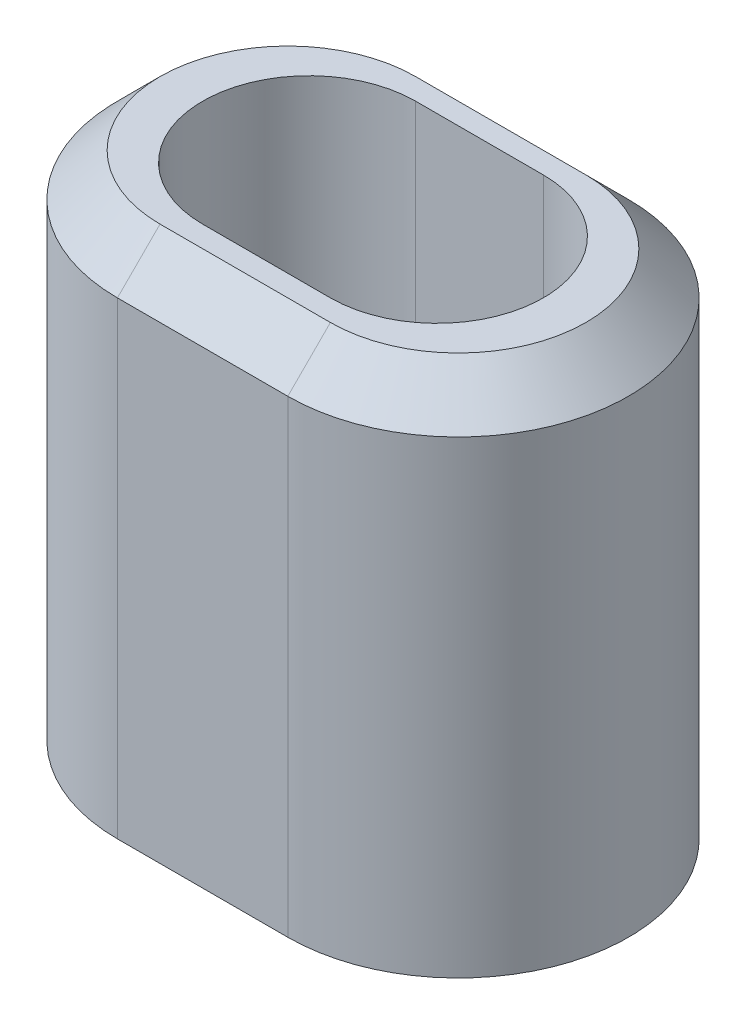
ISO-10303-21;
HEADER;
FILE_DESCRIPTION(('STEP AP214'),'2;1');
FILE_NAME('part.step','',(''),(''),'','','');
FILE_SCHEMA(('AUTOMOTIVE_DESIGN { 1 0 10303 214 1 1 1 1 }'));
ENDSEC;
DATA;
#1=APPLICATION_CONTEXT('core data for automotive mechanical design processes');
#2=APPLICATION_PROTOCOL_DEFINITION('international standard','automotive_design',2000,#1);
#3=PRODUCT_CONTEXT('',#1,'mechanical');
#4=PRODUCT('Part','Part','',(#3));
#5=PRODUCT_RELATED_PRODUCT_CATEGORY('part','',(#4));
#6=PRODUCT_DEFINITION_FORMATION('','',#4);
#7=PRODUCT_DEFINITION_CONTEXT('part definition',#1,'design');
#8=PRODUCT_DEFINITION('design','',#6,#7);
#9=PRODUCT_DEFINITION_SHAPE('','',#8);
#10=(LENGTH_UNIT() NAMED_UNIT(*) SI_UNIT(.MILLI.,.METRE.));
#11=(NAMED_UNIT(*) PLANE_ANGLE_UNIT() SI_UNIT($,.RADIAN.));
#12=(NAMED_UNIT(*) SI_UNIT($,.STERADIAN.) SOLID_ANGLE_UNIT());
#13=UNCERTAINTY_MEASURE_WITH_UNIT(LENGTH_MEASURE(1.E-05),#10,'distance_accuracy_value','');
#14=(GEOMETRIC_REPRESENTATION_CONTEXT(3) GLOBAL_UNCERTAINTY_ASSIGNED_CONTEXT((#13)) GLOBAL_UNIT_ASSIGNED_CONTEXT((#10,
#11,#12)) REPRESENTATION_CONTEXT('',''));
#15=CARTESIAN_POINT('',(0.,0.,0.));
#16=DIRECTION('',(0.,0.,1.));
#17=DIRECTION('',(1.,0.,0.));
#18=AXIS2_PLACEMENT_3D('',#15,#16,#17);
#19=CARTESIAN_POINT('',(0.,60.,0.));
#20=DIRECTION('',(0.,1.,0.));
#21=DIRECTION('',(0.,0.,1.));
#22=AXIS2_PLACEMENT_3D('',#19,#20,#21);
#23=PLANE('',#22);
#24=DIRECTION('',(-1.,0.,0.));
#25=VECTOR('',#24,1.);
#26=CARTESIAN_POINT('',(-20.,60.,-15.));
#27=LINE('',#26,#25);
#28=CARTESIAN_POINT('',(0.,60.,-15.));
#29=VERTEX_POINT('',#28);
#30=CARTESIAN_POINT('',(-20.,60.,-15.));
#31=VERTEX_POINT('',#30);
#32=EDGE_CURVE('E208',#29,#31,#27,.T.);
#33=ORIENTED_EDGE('',*,*,#32,.T.);
#34=CARTESIAN_POINT('',(-20.,60.,0.));
#35=DIRECTION('',(0.,1.,0.));
#36=DIRECTION('',(0.,0.,1.));
#37=AXIS2_PLACEMENT_3D('',#34,#35,#36);
#38=CIRCLE('',#37,15.);
#39=CARTESIAN_POINT('',(-20.,60.,15.));
#40=VERTEX_POINT('',#39);
#41=EDGE_CURVE('E211',#31,#40,#38,.T.);
#42=ORIENTED_EDGE('',*,*,#41,.T.);
#43=DIRECTION('',(1.,0.,0.));
#44=VECTOR('',#43,1.);
#45=CARTESIAN_POINT('',(0.,60.,15.));
#46=LINE('',#45,#44);
#47=CARTESIAN_POINT('',(0.,60.,15.));
#48=VERTEX_POINT('',#47);
#49=EDGE_CURVE('E202',#40,#48,#46,.T.);
#50=ORIENTED_EDGE('',*,*,#49,.T.);
#51=CARTESIAN_POINT('',(0.,60.,0.));
#52=DIRECTION('',(0.,1.,0.));
#53=DIRECTION('',(0.,0.,1.));
#54=AXIS2_PLACEMENT_3D('',#51,#52,#53);
#55=CIRCLE('',#54,15.);
#56=EDGE_CURVE('E205',#48,#29,#55,.T.);
#57=ORIENTED_EDGE('',*,*,#56,.T.);
#58=EDGE_LOOP('',(#33,#42,#50,#57));
#59=FACE_BOUND('',#58,.T.);
#60=DIRECTION('',(-1.,0.,0.));
#61=VECTOR('',#60,1.);
#62=CARTESIAN_POINT('',(-2.5,60.,-12.5));
#63=LINE('',#62,#61);
#64=CARTESIAN_POINT('',(-2.5,60.,-12.5));
#65=VERTEX_POINT('',#64);
#66=CARTESIAN_POINT('',(-17.5,60.,-12.5));
#67=VERTEX_POINT('',#66);
#68=EDGE_CURVE('E133',#65,#67,#63,.T.);
#69=ORIENTED_EDGE('',*,*,#68,.F.);
#70=CARTESIAN_POINT('',(-2.49999999999999,60.,0.));
#71=DIRECTION('',(0.,1.,0.));
#72=DIRECTION('',(0.,0.,1.));
#73=AXIS2_PLACEMENT_3D('',#70,#71,#72);
#74=CIRCLE('',#73,12.5);
#75=CARTESIAN_POINT('',(-2.49999999999998,60.,12.5));
#76=VERTEX_POINT('',#75);
#77=EDGE_CURVE('E122',#76,#65,#74,.T.);
#78=ORIENTED_EDGE('',*,*,#77,.F.);
#79=DIRECTION('',(1.,0.,0.));
#80=VECTOR('',#79,1.);
#81=CARTESIAN_POINT('',(-2.49999999999998,60.,12.5));
#82=LINE('',#81,#80);
#83=CARTESIAN_POINT('',(-17.5,60.,12.5));
#84=VERTEX_POINT('',#83);
#85=EDGE_CURVE('E151',#84,#76,#82,.T.);
#86=ORIENTED_EDGE('',*,*,#85,.F.);
#87=CARTESIAN_POINT('',(-17.5,60.,0.));
#88=DIRECTION('',(0.,1.,0.));
#89=DIRECTION('',(0.,0.,1.));
#90=AXIS2_PLACEMENT_3D('',#87,#88,#89);
#91=CIRCLE('',#90,12.5);
#92=EDGE_CURVE('E147',#67,#84,#91,.T.);
#93=ORIENTED_EDGE('',*,*,#92,.F.);
#94=EDGE_LOOP('',(#69,#78,#86,#93));
#95=FACE_BOUND('',#94,.T.);
#96=ADVANCED_FACE('F41',(#59,#95),#23,.T.);
#97=CARTESIAN_POINT('',(0.,0.,0.));
#98=DIRECTION('',(0.,1.,0.));
#99=DIRECTION('',(0.,0.,1.));
#100=AXIS2_PLACEMENT_3D('',#97,#98,#99);
#101=PLANE('',#100);
#102=CARTESIAN_POINT('',(0.,0.,0.));
#103=DIRECTION('',(0.,1.,0.));
#104=DIRECTION('',(0.,0.,1.));
#105=AXIS2_PLACEMENT_3D('',#102,#103,#104);
#106=CIRCLE('',#105,20.);
#107=CARTESIAN_POINT('',(0.,0.,20.));
#108=VERTEX_POINT('',#107);
#109=CARTESIAN_POINT('',(0.,0.,-20.));
#110=VERTEX_POINT('',#109);
#111=EDGE_CURVE('E142',#108,#110,#106,.T.);
#112=ORIENTED_EDGE('',*,*,#111,.F.);
#113=DIRECTION('',(1.,0.,0.));
#114=VECTOR('',#113,1.);
#115=CARTESIAN_POINT('',(0.,0.,20.));
#116=LINE('',#115,#114);
#117=CARTESIAN_POINT('',(-20.,0.,20.));
#118=VERTEX_POINT('',#117);
#119=EDGE_CURVE('E186',#118,#108,#116,.T.);
#120=ORIENTED_EDGE('',*,*,#119,.F.);
#121=CARTESIAN_POINT('',(-20.,0.,0.));
#122=DIRECTION('',(0.,1.,0.));
#123=DIRECTION('',(0.,0.,1.));
#124=AXIS2_PLACEMENT_3D('',#121,#122,#123);
#125=CIRCLE('',#124,20.);
#126=CARTESIAN_POINT('',(-20.,0.,-20.));
#127=VERTEX_POINT('',#126);
#128=EDGE_CURVE('E182',#127,#118,#125,.T.);
#129=ORIENTED_EDGE('',*,*,#128,.F.);
#130=DIRECTION('',(-1.,0.,0.));
#131=VECTOR('',#130,1.);
#132=CARTESIAN_POINT('',(0.,0.,-20.));
#133=LINE('',#132,#131);
#134=EDGE_CURVE('E178',#110,#127,#133,.T.);
#135=ORIENTED_EDGE('',*,*,#134,.F.);
#136=EDGE_LOOP('',(#112,#120,#129,#135));
#137=FACE_BOUND('',#136,.T.);
#138=CARTESIAN_POINT('',(-2.49999999999999,0.,0.));
#139=DIRECTION('',(0.,1.,0.));
#140=DIRECTION('',(0.,0.,1.));
#141=AXIS2_PLACEMENT_3D('',#138,#139,#140);
#142=CIRCLE('',#141,12.5);
#143=CARTESIAN_POINT('',(-2.49999999999998,0.,12.5));
#144=VERTEX_POINT('',#143);
#145=CARTESIAN_POINT('',(-2.5,0.,-12.5));
#146=VERTEX_POINT('',#145);
#147=EDGE_CURVE('E156',#144,#146,#142,.T.);
#148=ORIENTED_EDGE('',*,*,#147,.T.);
#149=DIRECTION('',(-1.,0.,0.));
#150=VECTOR('',#149,1.);
#151=CARTESIAN_POINT('',(-2.5,0.,-12.5));
#152=LINE('',#151,#150);
#153=CARTESIAN_POINT('',(-17.5,0.,-12.5));
#154=VERTEX_POINT('',#153);
#155=EDGE_CURVE('E140',#146,#154,#152,.T.);
#156=ORIENTED_EDGE('',*,*,#155,.T.);
#157=CARTESIAN_POINT('',(-17.5,0.,0.));
#158=DIRECTION('',(0.,1.,0.));
#159=DIRECTION('',(0.,0.,1.));
#160=AXIS2_PLACEMENT_3D('',#157,#158,#159);
#161=CIRCLE('',#160,12.5);
#162=CARTESIAN_POINT('',(-17.5,0.,12.5));
#163=VERTEX_POINT('',#162);
#164=EDGE_CURVE('E161',#154,#163,#161,.T.);
#165=ORIENTED_EDGE('',*,*,#164,.T.);
#166=DIRECTION('',(1.,0.,0.));
#167=VECTOR('',#166,1.);
#168=CARTESIAN_POINT('',(-2.49999999999998,0.,12.5));
#169=LINE('',#168,#167);
#170=EDGE_CURVE('E134',#163,#144,#169,.T.);
#171=ORIENTED_EDGE('',*,*,#170,.T.);
#172=EDGE_LOOP('',(#148,#156,#165,#171));
#173=FACE_BOUND('',#172,.T.);
#174=ADVANCED_FACE('F259',(#137,#173),#101,.F.);
#175=CARTESIAN_POINT('',(0.,60.,0.));
#176=DIRECTION('',(0.,-1.,0.));
#177=DIRECTION('',(0.,0.,-1.));
#178=AXIS2_PLACEMENT_3D('',#175,#176,#177);
#179=CYLINDRICAL_SURFACE('',#178,20.);
#180=DIRECTION('',(0.,-1.,0.));
#181=VECTOR('',#180,1.);
#182=CARTESIAN_POINT('',(0.,60.,-20.));
#183=LINE('',#182,#181);
#184=CARTESIAN_POINT('',(0.,55.,-20.));
#185=VERTEX_POINT('',#184);
#186=EDGE_CURVE('E199',#185,#110,#183,.T.);
#187=ORIENTED_EDGE('',*,*,#186,.F.);
#188=CARTESIAN_POINT('',(0.,55.,0.));
#189=DIRECTION('',(0.,1.,0.));
#190=DIRECTION('',(0.,0.,1.));
#191=AXIS2_PLACEMENT_3D('',#188,#189,#190);
#192=CIRCLE('',#191,20.);
#193=CARTESIAN_POINT('',(0.,55.,20.));
#194=VERTEX_POINT('',#193);
#195=EDGE_CURVE('E52',#185,#194,#192,.F.);
#196=ORIENTED_EDGE('',*,*,#195,.T.);
#197=DIRECTION('',(0.,-1.,0.));
#198=VECTOR('',#197,1.);
#199=CARTESIAN_POINT('',(0.,60.,20.));
#200=LINE('',#199,#198);
#201=EDGE_CURVE('E190',#194,#108,#200,.T.);
#202=ORIENTED_EDGE('',*,*,#201,.T.);
#203=ORIENTED_EDGE('',*,*,#111,.T.);
#204=EDGE_LOOP('',(#187,#196,#202,#203));
#205=FACE_BOUND('',#204,.T.);
#206=ADVANCED_FACE('F264',(#205),#179,.T.);
#207=CARTESIAN_POINT('',(0.,60.,-20.));
#208=DIRECTION('',(0.,0.,1.));
#209=DIRECTION('',(1.,0.,0.));
#210=AXIS2_PLACEMENT_3D('',#207,#208,#209);
#211=PLANE('',#210);
#212=DIRECTION('',(0.,-1.,0.));
#213=VECTOR('',#212,1.);
#214=CARTESIAN_POINT('',(-20.,60.,-20.));
#215=LINE('',#214,#213);
#216=CARTESIAN_POINT('',(-20.,55.,-20.));
#217=VERTEX_POINT('',#216);
#218=EDGE_CURVE('E196',#217,#127,#215,.T.);
#219=ORIENTED_EDGE('',*,*,#218,.F.);
#220=DIRECTION('',(1.,0.,0.));
#221=VECTOR('',#220,1.);
#222=CARTESIAN_POINT('',(0.,55.,-20.));
#223=LINE('',#222,#221);
#224=EDGE_CURVE('E67',#217,#185,#223,.T.);
#225=ORIENTED_EDGE('',*,*,#224,.T.);
#226=ORIENTED_EDGE('',*,*,#186,.T.);
#227=ORIENTED_EDGE('',*,*,#134,.T.);
#228=EDGE_LOOP('',(#219,#225,#226,#227));
#229=FACE_BOUND('',#228,.T.);
#230=ADVANCED_FACE('F274',(#229),#211,.F.);
#231=CARTESIAN_POINT('',(-20.,60.,0.));
#232=DIRECTION('',(0.,-1.,0.));
#233=DIRECTION('',(0.,0.,-1.));
#234=AXIS2_PLACEMENT_3D('',#231,#232,#233);
#235=CYLINDRICAL_SURFACE('',#234,20.);
#236=DIRECTION('',(0.,-1.,0.));
#237=VECTOR('',#236,1.);
#238=CARTESIAN_POINT('',(-20.,60.,20.));
#239=LINE('',#238,#237);
#240=CARTESIAN_POINT('',(-20.,55.,20.));
#241=VERTEX_POINT('',#240);
#242=EDGE_CURVE('E193',#241,#118,#239,.T.);
#243=ORIENTED_EDGE('',*,*,#242,.F.);
#244=CARTESIAN_POINT('',(-20.,55.,0.));
#245=DIRECTION('',(0.,1.,0.));
#246=DIRECTION('',(0.,0.,1.));
#247=AXIS2_PLACEMENT_3D('',#244,#245,#246);
#248=CIRCLE('',#247,20.);
#249=EDGE_CURVE('E215',#241,#217,#248,.F.);
#250=ORIENTED_EDGE('',*,*,#249,.T.);
#251=ORIENTED_EDGE('',*,*,#218,.T.);
#252=ORIENTED_EDGE('',*,*,#128,.T.);
#253=EDGE_LOOP('',(#243,#250,#251,#252));
#254=FACE_BOUND('',#253,.T.);
#255=ADVANCED_FACE('F251',(#254),#235,.T.);
#256=CARTESIAN_POINT('',(0.,60.,20.));
#257=DIRECTION('',(0.,0.,-1.));
#258=DIRECTION('',(-1.,0.,0.));
#259=AXIS2_PLACEMENT_3D('',#256,#257,#258);
#260=PLANE('',#259);
#261=ORIENTED_EDGE('',*,*,#201,.F.);
#262=DIRECTION('',(-1.,0.,0.));
#263=VECTOR('',#262,1.);
#264=CARTESIAN_POINT('',(-20.,55.,20.));
#265=LINE('',#264,#263);
#266=EDGE_CURVE('E11',#194,#241,#265,.T.);
#267=ORIENTED_EDGE('',*,*,#266,.T.);
#268=ORIENTED_EDGE('',*,*,#242,.T.);
#269=ORIENTED_EDGE('',*,*,#119,.T.);
#270=EDGE_LOOP('',(#261,#267,#268,#269));
#271=FACE_BOUND('',#270,.T.);
#272=ADVANCED_FACE('F248',(#271),#260,.F.);
#273=CARTESIAN_POINT('',(-2.49999999999999,60.,0.));
#274=DIRECTION('',(0.,-1.,0.));
#275=DIRECTION('',(0.,0.,-1.));
#276=AXIS2_PLACEMENT_3D('',#273,#274,#275);
#277=CYLINDRICAL_SURFACE('',#276,12.5);
#278=ORIENTED_EDGE('',*,*,#147,.F.);
#279=DIRECTION('',(0.,-1.,0.));
#280=VECTOR('',#279,1.);
#281=CARTESIAN_POINT('',(-2.49999999999998,60.,12.5));
#282=LINE('',#281,#280);
#283=EDGE_CURVE('E128',#76,#144,#282,.T.);
#284=ORIENTED_EDGE('',*,*,#283,.F.);
#285=ORIENTED_EDGE('',*,*,#77,.T.);
#286=DIRECTION('',(0.,-1.,0.));
#287=VECTOR('',#286,1.);
#288=CARTESIAN_POINT('',(-2.5,60.,-12.5));
#289=LINE('',#288,#287);
#290=EDGE_CURVE('E125',#65,#146,#289,.T.);
#291=ORIENTED_EDGE('',*,*,#290,.T.);
#292=EDGE_LOOP('',(#278,#284,#285,#291));
#293=FACE_BOUND('',#292,.T.);
#294=ADVANCED_FACE('F124',(#293),#277,.F.);
#295=CARTESIAN_POINT('',(-2.5,60.,-12.5));
#296=DIRECTION('',(0.,0.,1.));
#297=DIRECTION('',(1.,0.,0.));
#298=AXIS2_PLACEMENT_3D('',#295,#296,#297);
#299=PLANE('',#298);
#300=ORIENTED_EDGE('',*,*,#155,.F.);
#301=ORIENTED_EDGE('',*,*,#290,.F.);
#302=ORIENTED_EDGE('',*,*,#68,.T.);
#303=DIRECTION('',(0.,-1.,0.));
#304=VECTOR('',#303,1.);
#305=CARTESIAN_POINT('',(-17.5,60.,-12.5));
#306=LINE('',#305,#304);
#307=EDGE_CURVE('E143',#67,#154,#306,.T.);
#308=ORIENTED_EDGE('',*,*,#307,.T.);
#309=EDGE_LOOP('',(#300,#301,#302,#308));
#310=FACE_BOUND('',#309,.T.);
#311=ADVANCED_FACE('F137',(#310),#299,.T.);
#312=CARTESIAN_POINT('',(-17.5,60.,0.));
#313=DIRECTION('',(0.,-1.,0.));
#314=DIRECTION('',(0.,0.,-1.));
#315=AXIS2_PLACEMENT_3D('',#312,#313,#314);
#316=CYLINDRICAL_SURFACE('',#315,12.5);
#317=ORIENTED_EDGE('',*,*,#164,.F.);
#318=ORIENTED_EDGE('',*,*,#307,.F.);
#319=ORIENTED_EDGE('',*,*,#92,.T.);
#320=DIRECTION('',(0.,-1.,0.));
#321=VECTOR('',#320,1.);
#322=CARTESIAN_POINT('',(-17.5,60.,12.5));
#323=LINE('',#322,#321);
#324=EDGE_CURVE('E170',#84,#163,#323,.T.);
#325=ORIENTED_EDGE('',*,*,#324,.T.);
#326=EDGE_LOOP('',(#317,#318,#319,#325));
#327=FACE_BOUND('',#326,.T.);
#328=ADVANCED_FACE('F299',(#327),#316,.F.);
#329=CARTESIAN_POINT('',(-2.49999999999998,60.,12.5));
#330=DIRECTION('',(0.,0.,-1.));
#331=DIRECTION('',(-1.,0.,0.));
#332=AXIS2_PLACEMENT_3D('',#329,#330,#331);
#333=PLANE('',#332);
#334=ORIENTED_EDGE('',*,*,#170,.F.);
#335=ORIENTED_EDGE('',*,*,#324,.F.);
#336=ORIENTED_EDGE('',*,*,#85,.T.);
#337=ORIENTED_EDGE('',*,*,#283,.T.);
#338=EDGE_LOOP('',(#334,#335,#336,#337));
#339=FACE_BOUND('',#338,.T.);
#340=ADVANCED_FACE('F295',(#339),#333,.T.);
#341=CARTESIAN_POINT('',(0.,60.,0.));
#342=DIRECTION('',(0.,-1.,0.));
#343=DIRECTION('',(0.,0.,-1.));
#344=AXIS2_PLACEMENT_3D('',#341,#342,#343);
#345=CONICAL_SURFACE('',#344,15.,0.785398163397446);
#346=DIRECTION('',(0.,0.707106781186549,-0.707106781186545));
#347=VECTOR('',#346,1.);
#348=CARTESIAN_POINT('',(0.,55.,20.));
#349=LINE('',#348,#347);
#350=EDGE_CURVE('E228',#194,#48,#349,.T.);
#351=ORIENTED_EDGE('',*,*,#350,.F.);
#352=ORIENTED_EDGE('',*,*,#195,.F.);
#353=DIRECTION('',(0.,-0.707106781186549,-0.707106781186545));
#354=VECTOR('',#353,1.);
#355=CARTESIAN_POINT('',(0.,60.,-15.));
#356=LINE('',#355,#354);
#357=EDGE_CURVE('E46',#29,#185,#356,.T.);
#358=ORIENTED_EDGE('',*,*,#357,.F.);
#359=ORIENTED_EDGE('',*,*,#56,.F.);
#360=EDGE_LOOP('',(#351,#352,#358,#359));
#361=FACE_BOUND('',#360,.T.);
#362=ADVANCED_FACE('F44',(#361),#345,.T.);
#363=CARTESIAN_POINT('',(0.,60.,-15.));
#364=DIRECTION('',(0.,0.707106781186545,-0.70710678118655));
#365=DIRECTION('',(1.,0.,0.));
#366=AXIS2_PLACEMENT_3D('',#363,#364,#365);
#367=PLANE('',#366);
#368=ORIENTED_EDGE('',*,*,#357,.T.);
#369=ORIENTED_EDGE('',*,*,#224,.F.);
#370=DIRECTION('',(0.,-0.70710678118655,-0.707106781186545));
#371=VECTOR('',#370,1.);
#372=CARTESIAN_POINT('',(-20.,60.,-15.));
#373=LINE('',#372,#371);
#374=EDGE_CURVE('E226',#31,#217,#373,.T.);
#375=ORIENTED_EDGE('',*,*,#374,.F.);
#376=ORIENTED_EDGE('',*,*,#32,.F.);
#377=EDGE_LOOP('',(#368,#369,#375,#376));
#378=FACE_BOUND('',#377,.T.);
#379=ADVANCED_FACE('F240',(#378),#367,.T.);
#380=CARTESIAN_POINT('',(0.,60.,15.));
#381=DIRECTION('',(0.,0.707106781186545,0.70710678118655));
#382=DIRECTION('',(-1.,0.,0.));
#383=AXIS2_PLACEMENT_3D('',#380,#381,#382);
#384=PLANE('',#383);
#385=ORIENTED_EDGE('',*,*,#350,.T.);
#386=ORIENTED_EDGE('',*,*,#49,.F.);
#387=DIRECTION('',(0.,0.70710678118655,-0.707106781186545));
#388=VECTOR('',#387,1.);
#389=CARTESIAN_POINT('',(-20.,55.,20.));
#390=LINE('',#389,#388);
#391=EDGE_CURVE('E223',#241,#40,#390,.T.);
#392=ORIENTED_EDGE('',*,*,#391,.F.);
#393=ORIENTED_EDGE('',*,*,#266,.F.);
#394=EDGE_LOOP('',(#385,#386,#392,#393));
#395=FACE_BOUND('',#394,.T.);
#396=ADVANCED_FACE('F245',(#395),#384,.T.);
#397=CARTESIAN_POINT('',(-20.,60.,0.));
#398=DIRECTION('',(0.,-1.,0.));
#399=DIRECTION('',(0.,0.,-1.));
#400=AXIS2_PLACEMENT_3D('',#397,#398,#399);
#401=CONICAL_SURFACE('',#400,15.,0.785398163397446);
#402=ORIENTED_EDGE('',*,*,#374,.T.);
#403=ORIENTED_EDGE('',*,*,#249,.F.);
#404=ORIENTED_EDGE('',*,*,#391,.T.);
#405=ORIENTED_EDGE('',*,*,#41,.F.);
#406=EDGE_LOOP('',(#402,#403,#404,#405));
#407=FACE_BOUND('',#406,.T.);
#408=ADVANCED_FACE('F255',(#407),#401,.T.);
#409=CLOSED_SHELL('',(#96,#174,#206,#230,#255,#272,#294,#311,#328,#340,#362,#379,#396,#408));
#410=MANIFOLD_SOLID_BREP('B2',#409);
#411=ADVANCED_BREP_SHAPE_REPRESENTATION('',(#18,#410),#14);
#412=SHAPE_DEFINITION_REPRESENTATION(#9,#411);
ENDSEC;
END-ISO-10303-21;
